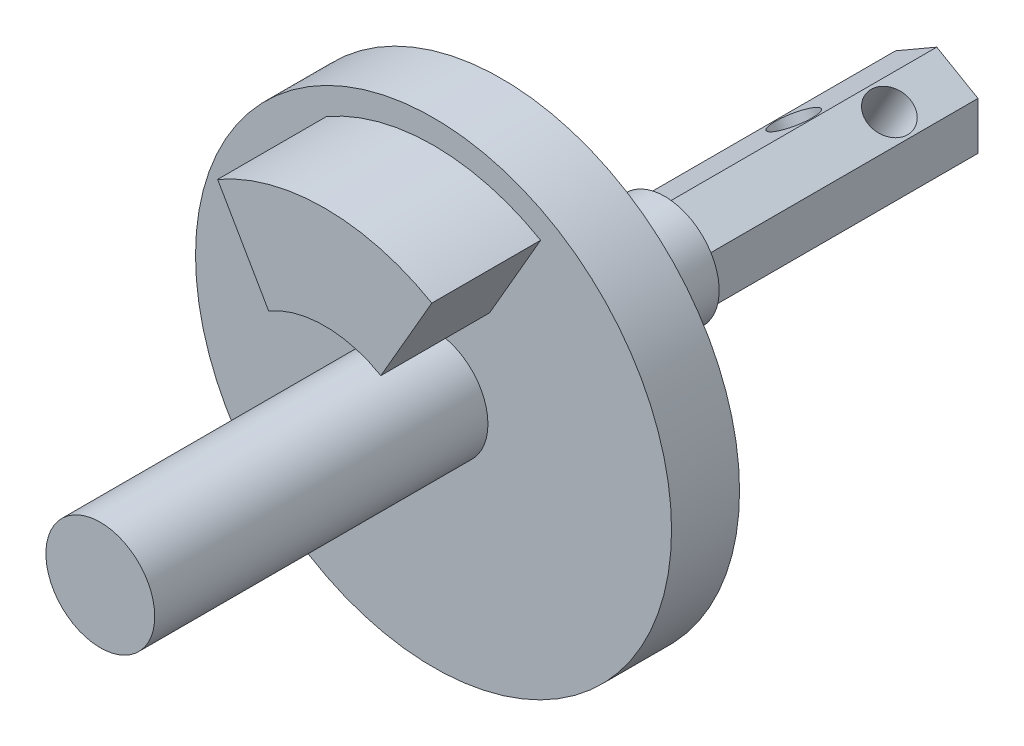
ISO-10303-21;
HEADER;
FILE_DESCRIPTION(('STEP AP214'),'2;1');
FILE_NAME('part.step','',(''),(''),'','','');
FILE_SCHEMA(('AUTOMOTIVE_DESIGN { 1 0 10303 214 1 1 1 1 }'));
ENDSEC;
DATA;
#1=APPLICATION_CONTEXT('core data for automotive mechanical design processes');
#2=APPLICATION_PROTOCOL_DEFINITION('international standard','automotive_design',2000,#1);
#3=PRODUCT_CONTEXT('',#1,'mechanical');
#4=PRODUCT('Part','Part','',(#3));
#5=PRODUCT_RELATED_PRODUCT_CATEGORY('part','',(#4));
#6=PRODUCT_DEFINITION_FORMATION('','',#4);
#7=PRODUCT_DEFINITION_CONTEXT('part definition',#1,'design');
#8=PRODUCT_DEFINITION('design','',#6,#7);
#9=PRODUCT_DEFINITION_SHAPE('','',#8);
#10=(LENGTH_UNIT() NAMED_UNIT(*) SI_UNIT(.MILLI.,.METRE.));
#11=(NAMED_UNIT(*) PLANE_ANGLE_UNIT() SI_UNIT($,.RADIAN.));
#12=(NAMED_UNIT(*) SI_UNIT($,.STERADIAN.) SOLID_ANGLE_UNIT());
#13=UNCERTAINTY_MEASURE_WITH_UNIT(LENGTH_MEASURE(1.E-05),#10,'distance_accuracy_value','');
#14=(GEOMETRIC_REPRESENTATION_CONTEXT(3) GLOBAL_UNCERTAINTY_ASSIGNED_CONTEXT((#13)) GLOBAL_UNIT_ASSIGNED_CONTEXT((#10,
#11,#12)) REPRESENTATION_CONTEXT('',''));
#15=CARTESIAN_POINT('',(0.,0.,0.));
#16=DIRECTION('',(0.,0.,1.));
#17=DIRECTION('',(1.,0.,0.));
#18=AXIS2_PLACEMENT_3D('',#15,#16,#17);
#19=CARTESIAN_POINT('',(0.,0.,2.5));
#20=DIRECTION('',(0.,0.,1.));
#21=DIRECTION('',(1.,0.,0.));
#22=AXIS2_PLACEMENT_3D('',#19,#20,#21);
#23=PLANE('',#22);
#24=CARTESIAN_POINT('',(0.,0.,2.5));
#25=DIRECTION('',(0.,0.,1.));
#26=DIRECTION('',(1.,0.,0.));
#27=AXIS2_PLACEMENT_3D('',#24,#25,#26);
#28=CIRCLE('',#27,4.);
#29=CARTESIAN_POINT('',(4.,0.,2.5));
#30=VERTEX_POINT('',#29);
#31=EDGE_CURVE('E140',#30,#30,#28,.T.);
#32=ORIENTED_EDGE('',*,*,#31,.F.);
#33=EDGE_LOOP('',(#32));
#34=FACE_BOUND('',#33,.T.);
#35=CARTESIAN_POINT('',(0.,0.,2.5));
#36=DIRECTION('',(0.,0.,1.));
#37=DIRECTION('',(1.,0.,0.));
#38=AXIS2_PLACEMENT_3D('',#35,#36,#37);
#39=CIRCLE('',#38,17.5);
#40=CARTESIAN_POINT('',(17.5,0.,2.5));
#41=VERTEX_POINT('',#40);
#42=EDGE_CURVE('E47',#41,#41,#39,.T.);
#43=ORIENTED_EDGE('',*,*,#42,.T.);
#44=EDGE_LOOP('',(#43));
#45=FACE_BOUND('',#44,.T.);
#46=DIRECTION('',(0.499999999999996,-0.866025403784441,0.));
#47=VECTOR('',#46,1.);
#48=CARTESIAN_POINT('',(-4.12499999999996,7.14470958122165,2.5));
#49=LINE('',#48,#47);
#50=CARTESIAN_POINT('',(-7.87499999999993,13.639900109605,2.5));
#51=VERTEX_POINT('',#50);
#52=CARTESIAN_POINT('',(-4.12499999999996,7.14470958122165,2.5));
#53=VERTEX_POINT('',#52);
#54=EDGE_CURVE('E165',#51,#53,#49,.T.);
#55=ORIENTED_EDGE('',*,*,#54,.F.);
#56=CARTESIAN_POINT('',(0.,0.,2.5));
#57=DIRECTION('',(0.,0.,1.));
#58=DIRECTION('',(-1.,0.,0.));
#59=AXIS2_PLACEMENT_3D('',#56,#57,#58);
#60=CIRCLE('',#59,15.75);
#61=CARTESIAN_POINT('',(7.87499999999993,13.639900109605,2.5));
#62=VERTEX_POINT('',#61);
#63=EDGE_CURVE('E149',#62,#51,#60,.T.);
#64=ORIENTED_EDGE('',*,*,#63,.F.);
#65=DIRECTION('',(0.499999999999995,0.866025403784441,0.));
#66=VECTOR('',#65,1.);
#67=CARTESIAN_POINT('',(7.87499999999993,13.639900109605,2.5));
#68=LINE('',#67,#66);
#69=CARTESIAN_POINT('',(4.12499999999996,7.14470958122164,2.5));
#70=VERTEX_POINT('',#69);
#71=EDGE_CURVE('E156',#70,#62,#68,.T.);
#72=ORIENTED_EDGE('',*,*,#71,.F.);
#73=CARTESIAN_POINT('',(0.,0.,2.5));
#74=DIRECTION('',(0.,0.,-1.));
#75=DIRECTION('',(1.,0.,0.));
#76=AXIS2_PLACEMENT_3D('',#73,#74,#75);
#77=CIRCLE('',#76,8.25);
#78=EDGE_CURVE('E167',#53,#70,#77,.T.);
#79=ORIENTED_EDGE('',*,*,#78,.F.);
#80=EDGE_LOOP('',(#55,#64,#72,#79));
#81=FACE_BOUND('',#80,.T.);
#82=ADVANCED_FACE('F38',(#34,#45,#81),#23,.T.);
#83=CARTESIAN_POINT('',(0.,0.,2.5));
#84=DIRECTION('',(0.,0.,-1.));
#85=DIRECTION('',(-1.,0.,0.));
#86=AXIS2_PLACEMENT_3D('',#83,#84,#85);
#87=CYLINDRICAL_SURFACE('',#86,17.5);
#88=ORIENTED_EDGE('',*,*,#42,.F.);
#89=EDGE_LOOP('',(#88));
#90=FACE_BOUND('',#89,.T.);
#91=CARTESIAN_POINT('',(0.,0.,-2.5));
#92=DIRECTION('',(0.,0.,1.));
#93=DIRECTION('',(1.,0.,0.));
#94=AXIS2_PLACEMENT_3D('',#91,#92,#93);
#95=CIRCLE('',#94,17.5);
#96=CARTESIAN_POINT('',(17.5,0.,-2.5));
#97=VERTEX_POINT('',#96);
#98=EDGE_CURVE('E42',#97,#97,#95,.T.);
#99=ORIENTED_EDGE('',*,*,#98,.T.);
#100=EDGE_LOOP('',(#99));
#101=FACE_BOUND('',#100,.T.);
#102=ADVANCED_FACE('F40',(#90,#101),#87,.T.);
#103=CARTESIAN_POINT('',(0.,0.,-2.5));
#104=DIRECTION('',(0.,0.,1.));
#105=DIRECTION('',(1.,0.,0.));
#106=AXIS2_PLACEMENT_3D('',#103,#104,#105);
#107=PLANE('',#106);
#108=CARTESIAN_POINT('',(0.,0.,-2.5));
#109=DIRECTION('',(0.,0.,-1.));
#110=DIRECTION('',(-1.,0.,0.));
#111=AXIS2_PLACEMENT_3D('',#108,#109,#110);
#112=CIRCLE('',#111,4.);
#113=CARTESIAN_POINT('',(-4.,0.,-2.5));
#114=VERTEX_POINT('',#113);
#115=EDGE_CURVE('E11',#114,#114,#112,.T.);
#116=ORIENTED_EDGE('',*,*,#115,.F.);
#117=EDGE_LOOP('',(#116));
#118=FACE_BOUND('',#117,.T.);
#119=ORIENTED_EDGE('',*,*,#98,.F.);
#120=EDGE_LOOP('',(#119));
#121=FACE_BOUND('',#120,.T.);
#122=ADVANCED_FACE('F186',(#118,#121),#107,.F.);
#123=CARTESIAN_POINT('',(0.,0.,10.5));
#124=DIRECTION('',(0.,0.,-1.));
#125=DIRECTION('',(-1.,0.,0.));
#126=AXIS2_PLACEMENT_3D('',#123,#124,#125);
#127=CYLINDRICAL_SURFACE('',#126,15.75);
#128=ORIENTED_EDGE('',*,*,#63,.T.);
#129=DIRECTION('',(0.,0.,-1.));
#130=VECTOR('',#129,1.);
#131=CARTESIAN_POINT('',(-7.87499999999993,13.639900109605,10.5));
#132=LINE('',#131,#130);
#133=CARTESIAN_POINT('',(-7.87499999999993,13.639900109605,10.5));
#134=VERTEX_POINT('',#133);
#135=EDGE_CURVE('E178',#134,#51,#132,.T.);
#136=ORIENTED_EDGE('',*,*,#135,.F.);
#137=CARTESIAN_POINT('',(0.,0.,10.5));
#138=DIRECTION('',(0.,0.,1.));
#139=DIRECTION('',(-1.,0.,0.));
#140=AXIS2_PLACEMENT_3D('',#137,#138,#139);
#141=CIRCLE('',#140,15.75);
#142=CARTESIAN_POINT('',(7.87499999999993,13.639900109605,10.5));
#143=VERTEX_POINT('',#142);
#144=EDGE_CURVE('E152',#143,#134,#141,.T.);
#145=ORIENTED_EDGE('',*,*,#144,.F.);
#146=DIRECTION('',(0.,0.,-1.));
#147=VECTOR('',#146,1.);
#148=CARTESIAN_POINT('',(7.87499999999993,13.639900109605,10.5));
#149=LINE('',#148,#147);
#150=EDGE_CURVE('E162',#143,#62,#149,.T.);
#151=ORIENTED_EDGE('',*,*,#150,.T.);
#152=EDGE_LOOP('',(#128,#136,#145,#151));
#153=FACE_BOUND('',#152,.T.);
#154=ADVANCED_FACE('F188',(#153),#127,.T.);
#155=CARTESIAN_POINT('',(-4.12499999999996,7.14470958122165,10.5));
#156=DIRECTION('',(0.866025403784441,0.499999999999996,0.));
#157=DIRECTION('',(-0.499999999999996,0.866025403784441,0.));
#158=AXIS2_PLACEMENT_3D('',#155,#156,#157);
#159=PLANE('',#158);
#160=ORIENTED_EDGE('',*,*,#54,.T.);
#161=DIRECTION('',(0.,0.,-1.));
#162=VECTOR('',#161,1.);
#163=CARTESIAN_POINT('',(-4.12499999999996,7.14470958122165,10.5));
#164=LINE('',#163,#162);
#165=CARTESIAN_POINT('',(-4.12499999999996,7.14470958122165,10.5));
#166=VERTEX_POINT('',#165);
#167=EDGE_CURVE('E175',#166,#53,#164,.T.);
#168=ORIENTED_EDGE('',*,*,#167,.F.);
#169=DIRECTION('',(0.499999999999996,-0.866025403784441,0.));
#170=VECTOR('',#169,1.);
#171=CARTESIAN_POINT('',(-4.12499999999996,7.14470958122165,10.5));
#172=LINE('',#171,#170);
#173=EDGE_CURVE('E155',#134,#166,#172,.T.);
#174=ORIENTED_EDGE('',*,*,#173,.F.);
#175=ORIENTED_EDGE('',*,*,#135,.T.);
#176=EDGE_LOOP('',(#160,#168,#174,#175));
#177=FACE_BOUND('',#176,.T.);
#178=ADVANCED_FACE('F195',(#177),#159,.F.);
#179=CARTESIAN_POINT('',(0.,0.,10.5));
#180=DIRECTION('',(0.,0.,-1.));
#181=DIRECTION('',(-1.,0.,0.));
#182=AXIS2_PLACEMENT_3D('',#179,#180,#181);
#183=CYLINDRICAL_SURFACE('',#182,8.25);
#184=ORIENTED_EDGE('',*,*,#78,.T.);
#185=DIRECTION('',(0.,0.,-1.));
#186=VECTOR('',#185,1.);
#187=CARTESIAN_POINT('',(4.12499999999996,7.14470958122164,10.5));
#188=LINE('',#187,#186);
#189=CARTESIAN_POINT('',(4.12499999999996,7.14470958122164,10.5));
#190=VERTEX_POINT('',#189);
#191=EDGE_CURVE('E173',#190,#70,#188,.T.);
#192=ORIENTED_EDGE('',*,*,#191,.F.);
#193=CARTESIAN_POINT('',(0.,0.,10.5));
#194=DIRECTION('',(0.,0.,-1.));
#195=DIRECTION('',(1.,0.,0.));
#196=AXIS2_PLACEMENT_3D('',#193,#194,#195);
#197=CIRCLE('',#196,8.25);
#198=EDGE_CURVE('E158',#166,#190,#197,.T.);
#199=ORIENTED_EDGE('',*,*,#198,.F.);
#200=ORIENTED_EDGE('',*,*,#167,.T.);
#201=EDGE_LOOP('',(#184,#192,#199,#200));
#202=FACE_BOUND('',#201,.T.);
#203=ADVANCED_FACE('F212',(#202),#183,.F.);
#204=CARTESIAN_POINT('',(7.87499999999993,13.639900109605,10.5));
#205=DIRECTION('',(-0.866025403784441,0.499999999999995,0.));
#206=DIRECTION('',(-0.499999999999995,-0.866025403784441,0.));
#207=AXIS2_PLACEMENT_3D('',#204,#205,#206);
#208=PLANE('',#207);
#209=ORIENTED_EDGE('',*,*,#71,.T.);
#210=ORIENTED_EDGE('',*,*,#150,.F.);
#211=DIRECTION('',(0.499999999999995,0.866025403784441,0.));
#212=VECTOR('',#211,1.);
#213=CARTESIAN_POINT('',(7.87499999999993,13.639900109605,10.5));
#214=LINE('',#213,#212);
#215=EDGE_CURVE('E160',#190,#143,#214,.T.);
#216=ORIENTED_EDGE('',*,*,#215,.F.);
#217=ORIENTED_EDGE('',*,*,#191,.T.);
#218=EDGE_LOOP('',(#209,#210,#216,#217));
#219=FACE_BOUND('',#218,.T.);
#220=ADVANCED_FACE('F216',(#219),#208,.F.);
#221=CARTESIAN_POINT('',(0.,0.,10.5));
#222=DIRECTION('',(0.,0.,-1.));
#223=DIRECTION('',(-1.,0.,0.));
#224=AXIS2_PLACEMENT_3D('',#221,#222,#223);
#225=PLANE('',#224);
#226=ORIENTED_EDGE('',*,*,#144,.T.);
#227=ORIENTED_EDGE('',*,*,#173,.T.);
#228=ORIENTED_EDGE('',*,*,#198,.T.);
#229=ORIENTED_EDGE('',*,*,#215,.T.);
#230=EDGE_LOOP('',(#226,#227,#228,#229));
#231=FACE_BOUND('',#230,.T.);
#232=ADVANCED_FACE('F220',(#231),#225,.F.);
#233=CARTESIAN_POINT('',(0.,0.,27.));
#234=DIRECTION('',(0.,0.,-1.));
#235=DIRECTION('',(-1.,0.,0.));
#236=AXIS2_PLACEMENT_3D('',#233,#234,#235);
#237=CYLINDRICAL_SURFACE('',#236,4.);
#238=CARTESIAN_POINT('',(0.,0.,27.));
#239=DIRECTION('',(0.,0.,1.));
#240=DIRECTION('',(1.,0.,0.));
#241=AXIS2_PLACEMENT_3D('',#238,#239,#240);
#242=CIRCLE('',#241,4.);
#243=CARTESIAN_POINT('',(4.,0.,27.));
#244=VERTEX_POINT('',#243);
#245=EDGE_CURVE('E146',#244,#244,#242,.T.);
#246=ORIENTED_EDGE('',*,*,#245,.F.);
#247=EDGE_LOOP('',(#246));
#248=FACE_BOUND('',#247,.T.);
#249=ORIENTED_EDGE('',*,*,#31,.T.);
#250=EDGE_LOOP('',(#249));
#251=FACE_BOUND('',#250,.T.);
#252=ADVANCED_FACE('F224',(#248,#251),#237,.T.);
#253=CARTESIAN_POINT('',(0.,0.,27.));
#254=DIRECTION('',(0.,0.,1.));
#255=DIRECTION('',(1.,0.,0.));
#256=AXIS2_PLACEMENT_3D('',#253,#254,#255);
#257=PLANE('',#256);
#258=ORIENTED_EDGE('',*,*,#245,.T.);
#259=EDGE_LOOP('',(#258));
#260=FACE_BOUND('',#259,.T.);
#261=ADVANCED_FACE('F228',(#260),#257,.T.);
#262=CARTESIAN_POINT('',(0.,0.,-14.5));
#263=DIRECTION('',(0.,0.,1.));
#264=DIRECTION('',(1.,0.,0.));
#265=AXIS2_PLACEMENT_3D('',#262,#263,#264);
#266=CYLINDRICAL_SURFACE('',#265,4.);
#267=CARTESIAN_POINT('',(0.,0.,-14.5));
#268=DIRECTION('',(0.,0.,-1.));
#269=DIRECTION('',(-1.,0.,0.));
#270=AXIS2_PLACEMENT_3D('',#267,#268,#269);
#271=CIRCLE('',#270,4.);
#272=CARTESIAN_POINT('',(-4.,0.,-14.5));
#273=VERTEX_POINT('',#272);
#274=EDGE_CURVE('E137',#273,#273,#271,.T.);
#275=ORIENTED_EDGE('',*,*,#274,.F.);
#276=EDGE_LOOP('',(#275));
#277=FACE_BOUND('',#276,.T.);
#278=ORIENTED_EDGE('',*,*,#115,.T.);
#279=EDGE_LOOP('',(#278));
#280=FACE_BOUND('',#279,.T.);
#281=ADVANCED_FACE('F232',(#277,#280),#266,.T.);
#282=CARTESIAN_POINT('',(0.,0.,-14.5));
#283=DIRECTION('',(0.,0.,-1.));
#284=DIRECTION('',(-1.,0.,0.));
#285=AXIS2_PLACEMENT_3D('',#282,#283,#284);
#286=PLANE('',#285);
#287=DIRECTION('',(0.86602540378444,0.499999999999997,0.));
#288=VECTOR('',#287,1.);
#289=CARTESIAN_POINT('',(-3.03108891324554,1.75000000000003,-14.5));
#290=LINE('',#289,#288);
#291=CARTESIAN_POINT('',(-3.03108891324554,1.75000000000003,-14.5));
#292=VERTEX_POINT('',#291);
#293=CARTESIAN_POINT('',(0.,3.50000000000002,-14.5));
#294=VERTEX_POINT('',#293);
#295=EDGE_CURVE('E55',#292,#294,#290,.T.);
#296=ORIENTED_EDGE('',*,*,#295,.F.);
#297=DIRECTION('',(0.,1.,0.));
#298=VECTOR('',#297,1.);
#299=CARTESIAN_POINT('',(-3.03108891324552,-1.75,-14.5));
#300=LINE('',#299,#298);
#301=CARTESIAN_POINT('',(-3.03108891324552,-1.75,-14.5));
#302=VERTEX_POINT('',#301);
#303=EDGE_CURVE('E59',#302,#292,#300,.T.);
#304=ORIENTED_EDGE('',*,*,#303,.F.);
#305=DIRECTION('',(-0.866025403784435,0.500000000000006,0.));
#306=VECTOR('',#305,1.);
#307=CARTESIAN_POINT('',(0.,-3.50000000000002,-14.5));
#308=LINE('',#307,#306);
#309=CARTESIAN_POINT('',(0.,-3.50000000000002,-14.5));
#310=VERTEX_POINT('',#309);
#311=EDGE_CURVE('E305',#310,#302,#308,.T.);
#312=ORIENTED_EDGE('',*,*,#311,.F.);
#313=DIRECTION('',(-0.86602540378444,-0.499999999999997,0.));
#314=VECTOR('',#313,1.);
#315=CARTESIAN_POINT('',(3.03108891324554,-1.75000000000003,-14.5));
#316=LINE('',#315,#314);
#317=CARTESIAN_POINT('',(3.03108891324554,-1.75000000000003,-14.5));
#318=VERTEX_POINT('',#317);
#319=EDGE_CURVE('E302',#318,#310,#316,.T.);
#320=ORIENTED_EDGE('',*,*,#319,.F.);
#321=DIRECTION('',(0.,-1.,0.));
#322=VECTOR('',#321,1.);
#323=CARTESIAN_POINT('',(3.03108891324554,1.74999999999999,-14.5));
#324=LINE('',#323,#322);
#325=CARTESIAN_POINT('',(3.03108891324554,1.74999999999999,-14.5));
#326=VERTEX_POINT('',#325);
#327=EDGE_CURVE('E299',#326,#318,#324,.T.);
#328=ORIENTED_EDGE('',*,*,#327,.F.);
#329=DIRECTION('',(0.866025403784435,-0.500000000000007,0.));
#330=VECTOR('',#329,1.);
#331=CARTESIAN_POINT('',(0.,3.50000000000002,-14.5));
#332=LINE('',#331,#330);
#333=EDGE_CURVE('E297',#294,#326,#332,.T.);
#334=ORIENTED_EDGE('',*,*,#333,.F.);
#335=EDGE_LOOP('',(#296,#304,#312,#320,#328,#334));
#336=FACE_BOUND('',#335,.T.);
#337=ORIENTED_EDGE('',*,*,#274,.T.);
#338=EDGE_LOOP('',(#337));
#339=FACE_BOUND('',#338,.T.);
#340=ADVANCED_FACE('F236',(#336,#339),#286,.T.);
#341=CARTESIAN_POINT('',(-3.03108891324554,1.75000000000003,-34.5));
#342=DIRECTION('',(0.499999999999997,-0.86602540378444,0.));
#343=DIRECTION('',(0.86602540378444,0.499999999999997,0.));
#344=AXIS2_PLACEMENT_3D('',#341,#342,#343);
#345=PLANE('',#344);
#346=CARTESIAN_POINT('',(-1.51554445662277,2.62500000000003,-25.5));
#347=DIRECTION('',(0.499999999999997,-0.86602540378444,0.));
#348=DIRECTION('',(0.86602540378444,0.499999999999997,0.));
#349=AXIS2_PLACEMENT_3D('',#346,#347,#348);
#350=CIRCLE('',#349,1.55);
#351=CARTESIAN_POINT('',(-0.173205080756888,3.40000000000002,-25.5));
#352=VERTEX_POINT('',#351);
#353=EDGE_CURVE('E279',#352,#352,#350,.F.);
#354=ORIENTED_EDGE('',*,*,#353,.F.);
#355=EDGE_LOOP('',(#354));
#356=FACE_BOUND('',#355,.T.);
#357=ORIENTED_EDGE('',*,*,#295,.T.);
#358=DIRECTION('',(0.,0.,1.));
#359=VECTOR('',#358,1.);
#360=CARTESIAN_POINT('',(0.,3.50000000000002,-34.5));
#361=LINE('',#360,#359);
#362=CARTESIAN_POINT('',(0.,3.50000000000002,-34.5));
#363=VERTEX_POINT('',#362);
#364=EDGE_CURVE('E120',#363,#294,#361,.T.);
#365=ORIENTED_EDGE('',*,*,#364,.F.);
#366=DIRECTION('',(0.86602540378444,0.499999999999997,0.));
#367=VECTOR('',#366,1.);
#368=CARTESIAN_POINT('',(-3.03108891324554,1.75000000000003,-34.5));
#369=LINE('',#368,#367);
#370=CARTESIAN_POINT('',(-3.03108891324554,1.75000000000003,-34.5));
#371=VERTEX_POINT('',#370);
#372=EDGE_CURVE('E126',#371,#363,#369,.T.);
#373=ORIENTED_EDGE('',*,*,#372,.F.);
#374=DIRECTION('',(0.,0.,1.));
#375=VECTOR('',#374,1.);
#376=CARTESIAN_POINT('',(-3.03108891324554,1.75000000000003,-34.5));
#377=LINE('',#376,#375);
#378=EDGE_CURVE('E295',#371,#292,#377,.T.);
#379=ORIENTED_EDGE('',*,*,#378,.T.);
#380=EDGE_LOOP('',(#357,#365,#373,#379));
#381=FACE_BOUND('',#380,.T.);
#382=ADVANCED_FACE('F136',(#356,#381),#345,.F.);
#383=CARTESIAN_POINT('',(0.,3.50000000000002,-34.5));
#384=DIRECTION('',(-0.500000000000007,-0.866025403784435,0.));
#385=DIRECTION('',(0.866025403784435,-0.500000000000007,0.));
#386=AXIS2_PLACEMENT_3D('',#383,#384,#385);
#387=PLANE('',#386);
#388=CARTESIAN_POINT('',(1.51554445662279,2.625,-29.5));
#389=DIRECTION('',(-0.500000000000007,-0.866025403784435,0.));
#390=DIRECTION('',(0.866025403784435,-0.500000000000007,0.));
#391=AXIS2_PLACEMENT_3D('',#388,#389,#390);
#392=CIRCLE('',#391,1.55000000000003);
#393=CARTESIAN_POINT('',(2.85788383248869,1.84999999999997,-29.5));
#394=VERTEX_POINT('',#393);
#395=EDGE_CURVE('E283',#394,#394,#392,.T.);
#396=ORIENTED_EDGE('',*,*,#395,.T.);
#397=EDGE_LOOP('',(#396));
#398=FACE_BOUND('',#397,.T.);
#399=ORIENTED_EDGE('',*,*,#333,.T.);
#400=DIRECTION('',(0.,0.,1.));
#401=VECTOR('',#400,1.);
#402=CARTESIAN_POINT('',(3.03108891324554,1.74999999999999,-34.5));
#403=LINE('',#402,#401);
#404=CARTESIAN_POINT('',(3.03108891324554,1.74999999999999,-34.5));
#405=VERTEX_POINT('',#404);
#406=EDGE_CURVE('E122',#405,#326,#403,.T.);
#407=ORIENTED_EDGE('',*,*,#406,.F.);
#408=DIRECTION('',(0.866025403784435,-0.500000000000007,0.));
#409=VECTOR('',#408,1.);
#410=CARTESIAN_POINT('',(0.,3.50000000000002,-34.5));
#411=LINE('',#410,#409);
#412=EDGE_CURVE('E115',#363,#405,#411,.T.);
#413=ORIENTED_EDGE('',*,*,#412,.F.);
#414=ORIENTED_EDGE('',*,*,#364,.T.);
#415=EDGE_LOOP('',(#399,#407,#413,#414));
#416=FACE_BOUND('',#415,.T.);
#417=ADVANCED_FACE('F118',(#398,#416),#387,.F.);
#418=CARTESIAN_POINT('',(3.03108891324554,1.74999999999999,-34.5));
#419=DIRECTION('',(-1.,0.,0.));
#420=DIRECTION('',(0.,-1.,0.));
#421=AXIS2_PLACEMENT_3D('',#418,#419,#420);
#422=PLANE('',#421);
#423=ORIENTED_EDGE('',*,*,#327,.T.);
#424=DIRECTION('',(0.,0.,1.));
#425=VECTOR('',#424,1.);
#426=CARTESIAN_POINT('',(3.03108891324554,-1.75000000000003,-34.5));
#427=LINE('',#426,#425);
#428=CARTESIAN_POINT('',(3.03108891324554,-1.75000000000003,-34.5));
#429=VERTEX_POINT('',#428);
#430=EDGE_CURVE('E142',#429,#318,#427,.T.);
#431=ORIENTED_EDGE('',*,*,#430,.F.);
#432=DIRECTION('',(0.,-1.,0.));
#433=VECTOR('',#432,1.);
#434=CARTESIAN_POINT('',(3.03108891324554,1.74999999999999,-34.5));
#435=LINE('',#434,#433);
#436=EDGE_CURVE('E125',#405,#429,#435,.T.);
#437=ORIENTED_EDGE('',*,*,#436,.F.);
#438=ORIENTED_EDGE('',*,*,#406,.T.);
#439=EDGE_LOOP('',(#423,#431,#437,#438));
#440=FACE_BOUND('',#439,.T.);
#441=ADVANCED_FACE('F245',(#440),#422,.F.);
#442=CARTESIAN_POINT('',(3.03108891324554,-1.75000000000003,-34.5));
#443=DIRECTION('',(-0.499999999999997,0.86602540378444,0.));
#444=DIRECTION('',(-0.86602540378444,-0.499999999999997,0.));
#445=AXIS2_PLACEMENT_3D('',#442,#443,#444);
#446=PLANE('',#445);
#447=CARTESIAN_POINT('',(1.51554445662277,-2.62500000000003,-25.5));
#448=DIRECTION('',(-0.499999999999997,0.86602540378444,0.));
#449=DIRECTION('',(-0.86602540378444,-0.499999999999997,0.));
#450=AXIS2_PLACEMENT_3D('',#447,#448,#449);
#451=CIRCLE('',#450,1.55);
#452=CARTESIAN_POINT('',(0.173205080756889,-3.40000000000002,-25.5));
#453=VERTEX_POINT('',#452);
#454=EDGE_CURVE('E276',#453,#453,#451,.T.);
#455=ORIENTED_EDGE('',*,*,#454,.T.);
#456=EDGE_LOOP('',(#455));
#457=FACE_BOUND('',#456,.T.);
#458=ORIENTED_EDGE('',*,*,#319,.T.);
#459=DIRECTION('',(0.,0.,1.));
#460=VECTOR('',#459,1.);
#461=CARTESIAN_POINT('',(0.,-3.50000000000002,-34.5));
#462=LINE('',#461,#460);
#463=CARTESIAN_POINT('',(0.,-3.50000000000002,-34.5));
#464=VERTEX_POINT('',#463);
#465=EDGE_CURVE('E312',#464,#310,#462,.T.);
#466=ORIENTED_EDGE('',*,*,#465,.F.);
#467=DIRECTION('',(-0.86602540378444,-0.499999999999997,0.));
#468=VECTOR('',#467,1.);
#469=CARTESIAN_POINT('',(3.03108891324554,-1.75000000000003,-34.5));
#470=LINE('',#469,#468);
#471=EDGE_CURVE('E290',#429,#464,#470,.T.);
#472=ORIENTED_EDGE('',*,*,#471,.F.);
#473=ORIENTED_EDGE('',*,*,#430,.T.);
#474=EDGE_LOOP('',(#458,#466,#472,#473));
#475=FACE_BOUND('',#474,.T.);
#476=ADVANCED_FACE('F249',(#457,#475),#446,.F.);
#477=CARTESIAN_POINT('',(0.,-3.50000000000002,-34.5));
#478=DIRECTION('',(0.500000000000006,0.866025403784435,0.));
#479=DIRECTION('',(-0.866025403784435,0.500000000000006,0.));
#480=AXIS2_PLACEMENT_3D('',#477,#478,#479);
#481=PLANE('',#480);
#482=CARTESIAN_POINT('',(-1.51554445662279,-2.625,-29.5));
#483=DIRECTION('',(-0.500000000000006,-0.866025403784435,0.));
#484=DIRECTION('',(0.866025403784435,-0.500000000000006,0.));
#485=AXIS2_PLACEMENT_3D('',#482,#483,#484);
#486=CIRCLE('',#485,1.55000000000003);
#487=CARTESIAN_POINT('',(-0.173205080756887,-3.40000000000002,-29.5));
#488=VERTEX_POINT('',#487);
#489=EDGE_CURVE('E280',#488,#488,#486,.T.);
#490=ORIENTED_EDGE('',*,*,#489,.F.);
#491=EDGE_LOOP('',(#490));
#492=FACE_BOUND('',#491,.T.);
#493=ORIENTED_EDGE('',*,*,#311,.T.);
#494=DIRECTION('',(0.,0.,1.));
#495=VECTOR('',#494,1.);
#496=CARTESIAN_POINT('',(-3.03108891324552,-1.75,-34.5));
#497=LINE('',#496,#495);
#498=CARTESIAN_POINT('',(-3.03108891324552,-1.75,-34.5));
#499=VERTEX_POINT('',#498);
#500=EDGE_CURVE('E309',#499,#302,#497,.T.);
#501=ORIENTED_EDGE('',*,*,#500,.F.);
#502=DIRECTION('',(-0.866025403784435,0.500000000000006,0.));
#503=VECTOR('',#502,1.);
#504=CARTESIAN_POINT('',(0.,-3.50000000000002,-34.5));
#505=LINE('',#504,#503);
#506=EDGE_CURVE('E292',#464,#499,#505,.T.);
#507=ORIENTED_EDGE('',*,*,#506,.F.);
#508=ORIENTED_EDGE('',*,*,#465,.T.);
#509=EDGE_LOOP('',(#493,#501,#507,#508));
#510=FACE_BOUND('',#509,.T.);
#511=ADVANCED_FACE('F253',(#492,#510),#481,.F.);
#512=CARTESIAN_POINT('',(-3.03108891324552,-1.75,-34.5));
#513=DIRECTION('',(1.,0.,0.));
#514=DIRECTION('',(0.,1.,0.));
#515=AXIS2_PLACEMENT_3D('',#512,#513,#514);
#516=PLANE('',#515);
#517=ORIENTED_EDGE('',*,*,#303,.T.);
#518=ORIENTED_EDGE('',*,*,#378,.F.);
#519=DIRECTION('',(0.,1.,0.));
#520=VECTOR('',#519,1.);
#521=CARTESIAN_POINT('',(-3.03108891324552,-1.75,-34.5));
#522=LINE('',#521,#520);
#523=EDGE_CURVE('E131',#499,#371,#522,.T.);
#524=ORIENTED_EDGE('',*,*,#523,.F.);
#525=ORIENTED_EDGE('',*,*,#500,.T.);
#526=EDGE_LOOP('',(#517,#518,#524,#525));
#527=FACE_BOUND('',#526,.T.);
#528=ADVANCED_FACE('F257',(#527),#516,.F.);
#529=CARTESIAN_POINT('',(0.,0.,-34.5));
#530=DIRECTION('',(0.,0.,-1.));
#531=DIRECTION('',(-1.,0.,0.));
#532=AXIS2_PLACEMENT_3D('',#529,#530,#531);
#533=PLANE('',#532);
#534=ORIENTED_EDGE('',*,*,#372,.T.);
#535=ORIENTED_EDGE('',*,*,#412,.T.);
#536=ORIENTED_EDGE('',*,*,#436,.T.);
#537=ORIENTED_EDGE('',*,*,#471,.T.);
#538=ORIENTED_EDGE('',*,*,#506,.T.);
#539=ORIENTED_EDGE('',*,*,#523,.T.);
#540=EDGE_LOOP('',(#534,#535,#536,#537,#538,#539));
#541=FACE_BOUND('',#540,.T.);
#542=ADVANCED_FACE('F129',(#541),#533,.T.);
#543=CARTESIAN_POINT('',(1.53445554337725,2.65775496308506,-29.5));
#544=DIRECTION('',(-0.500000000000006,-0.866025403784435,0.));
#545=DIRECTION('',(0.866025403784435,-0.500000000000006,0.));
#546=AXIS2_PLACEMENT_3D('',#543,#544,#545);
#547=CYLINDRICAL_SURFACE('',#546,1.55000000000003);
#548=ORIENTED_EDGE('',*,*,#489,.T.);
#549=EDGE_LOOP('',(#548));
#550=FACE_BOUND('',#549,.T.);
#551=ORIENTED_EDGE('',*,*,#395,.F.);
#552=EDGE_LOOP('',(#551));
#553=FACE_BOUND('',#552,.T.);
#554=ADVANCED_FACE('F264',(#550,#553),#547,.F.);
#555=CARTESIAN_POINT('',(-1.53445554337721,2.65775496308506,-25.5));
#556=DIRECTION('',(0.499999999999997,-0.86602540378444,0.));
#557=DIRECTION('',(0.86602540378444,0.499999999999997,0.));
#558=AXIS2_PLACEMENT_3D('',#555,#556,#557);
#559=CYLINDRICAL_SURFACE('',#558,1.55);
#560=ORIENTED_EDGE('',*,*,#454,.F.);
#561=EDGE_LOOP('',(#560));
#562=FACE_BOUND('',#561,.T.);
#563=ORIENTED_EDGE('',*,*,#353,.T.);
#564=EDGE_LOOP('',(#563));
#565=FACE_BOUND('',#564,.T.);
#566=ADVANCED_FACE('F267',(#562,#565),#559,.F.);
#567=CLOSED_SHELL('',(#82,#102,#122,#154,#178,#203,#220,#232,#252,#261,#281,#340,#382,#417,#441,
#476,#511,#528,#542,#554,#566));
#568=MANIFOLD_SOLID_BREP('B2',#567);
#569=ADVANCED_BREP_SHAPE_REPRESENTATION('',(#18,#568),#14);
#570=SHAPE_DEFINITION_REPRESENTATION(#9,#569);
ENDSEC;
END-ISO-10303-21;
